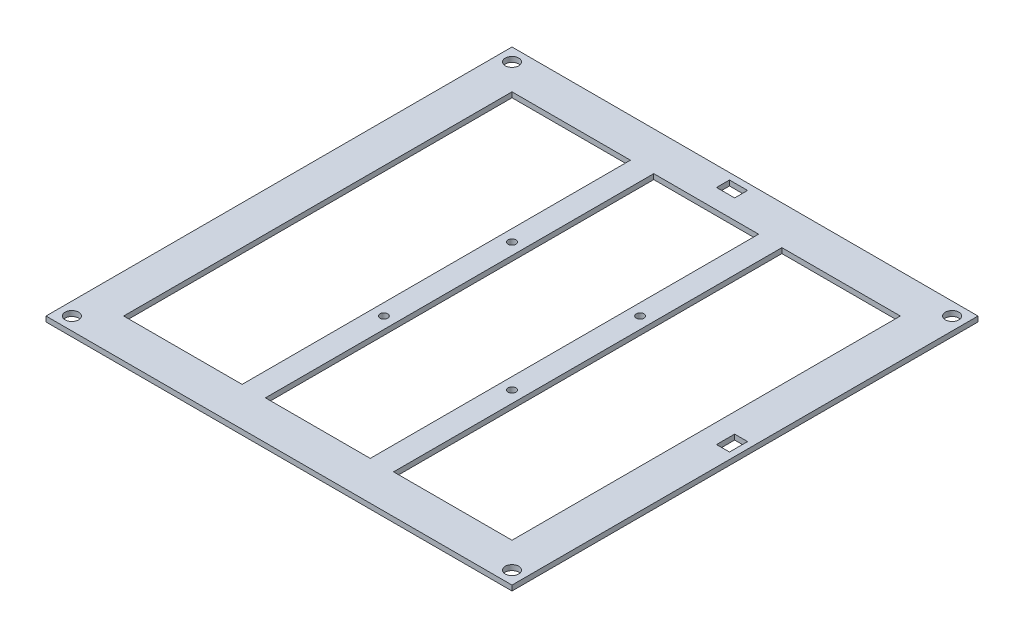
ISO-10303-21;
HEADER;
FILE_DESCRIPTION(('STEP AP214'),'2;1');
FILE_NAME('part.step','',(''),(''),'','','');
FILE_SCHEMA(('AUTOMOTIVE_DESIGN { 1 0 10303 214 1 1 1 1 }'));
ENDSEC;
DATA;
#1=APPLICATION_CONTEXT('core data for automotive mechanical design processes');
#2=APPLICATION_PROTOCOL_DEFINITION('international standard','automotive_design',2000,#1);
#3=PRODUCT_CONTEXT('',#1,'mechanical');
#4=PRODUCT('Part','Part','',(#3));
#5=PRODUCT_RELATED_PRODUCT_CATEGORY('part','',(#4));
#6=PRODUCT_DEFINITION_FORMATION('','',#4);
#7=PRODUCT_DEFINITION_CONTEXT('part definition',#1,'design');
#8=PRODUCT_DEFINITION('design','',#6,#7);
#9=PRODUCT_DEFINITION_SHAPE('','',#8);
#10=(LENGTH_UNIT() NAMED_UNIT(*) SI_UNIT(.MILLI.,.METRE.));
#11=(NAMED_UNIT(*) PLANE_ANGLE_UNIT() SI_UNIT($,.RADIAN.));
#12=(NAMED_UNIT(*) SI_UNIT($,.STERADIAN.) SOLID_ANGLE_UNIT());
#13=UNCERTAINTY_MEASURE_WITH_UNIT(LENGTH_MEASURE(1.E-05),#10,'distance_accuracy_value','');
#14=(GEOMETRIC_REPRESENTATION_CONTEXT(3) GLOBAL_UNCERTAINTY_ASSIGNED_CONTEXT((#13)) GLOBAL_UNIT_ASSIGNED_CONTEXT((#10,
#11,#12)) REPRESENTATION_CONTEXT('',''));
#15=CARTESIAN_POINT('',(0.,0.,0.));
#16=DIRECTION('',(0.,0.,1.));
#17=DIRECTION('',(1.,0.,0.));
#18=AXIS2_PLACEMENT_3D('',#15,#16,#17);
#19=CARTESIAN_POINT('',(0.,2.,0.));
#20=DIRECTION('',(0.,1.,0.));
#21=DIRECTION('',(0.,0.,1.));
#22=AXIS2_PLACEMENT_3D('',#19,#20,#21);
#23=PLANE('',#22);
#24=DIRECTION('',(-1.,0.,0.));
#25=VECTOR('',#24,1.);
#26=CARTESIAN_POINT('',(81.5,2.,-172.5));
#27=LINE('',#26,#25);
#28=CARTESIAN_POINT('',(88.5,2.,-172.5));
#29=VERTEX_POINT('',#28);
#30=CARTESIAN_POINT('',(81.5,2.,-172.5));
#31=VERTEX_POINT('',#30);
#32=EDGE_CURVE('E223',#29,#31,#27,.T.);
#33=ORIENTED_EDGE('',*,*,#32,.F.);
#34=DIRECTION('',(0.,0.,-1.));
#35=VECTOR('',#34,1.);
#36=CARTESIAN_POINT('',(88.5,2.,-172.5));
#37=LINE('',#36,#35);
#38=CARTESIAN_POINT('',(88.5,2.,-167.5));
#39=VERTEX_POINT('',#38);
#40=EDGE_CURVE('E221',#39,#29,#37,.T.);
#41=ORIENTED_EDGE('',*,*,#40,.F.);
#42=DIRECTION('',(1.,0.,0.));
#43=VECTOR('',#42,1.);
#44=CARTESIAN_POINT('',(81.5,2.,-167.5));
#45=LINE('',#44,#43);
#46=CARTESIAN_POINT('',(81.5,2.,-167.5));
#47=VERTEX_POINT('',#46);
#48=EDGE_CURVE('E229',#47,#39,#45,.T.);
#49=ORIENTED_EDGE('',*,*,#48,.F.);
#50=DIRECTION('',(0.,0.,1.));
#51=VECTOR('',#50,1.);
#52=CARTESIAN_POINT('',(81.5,2.,-172.5));
#53=LINE('',#52,#51);
#54=EDGE_CURVE('E226',#31,#47,#53,.T.);
#55=ORIENTED_EDGE('',*,*,#54,.F.);
#56=EDGE_LOOP('',(#33,#41,#49,#55));
#57=FACE_BOUND('',#56,.T.);
#58=DIRECTION('',(-1.,0.,0.));
#59=VECTOR('',#58,1.);
#60=CARTESIAN_POINT('',(167.5,2.,-88.5));
#61=LINE('',#60,#59);
#62=CARTESIAN_POINT('',(172.5,2.,-88.5));
#63=VERTEX_POINT('',#62);
#64=CARTESIAN_POINT('',(167.5,2.,-88.5));
#65=VERTEX_POINT('',#64);
#66=EDGE_CURVE('E254',#63,#65,#61,.T.);
#67=ORIENTED_EDGE('',*,*,#66,.F.);
#68=DIRECTION('',(0.,0.,-1.));
#69=VECTOR('',#68,1.);
#70=CARTESIAN_POINT('',(172.5,2.,-81.5));
#71=LINE('',#70,#69);
#72=CARTESIAN_POINT('',(172.5,2.,-81.5));
#73=VERTEX_POINT('',#72);
#74=EDGE_CURVE('E252',#73,#63,#71,.T.);
#75=ORIENTED_EDGE('',*,*,#74,.F.);
#76=DIRECTION('',(1.,0.,0.));
#77=VECTOR('',#76,1.);
#78=CARTESIAN_POINT('',(167.5,2.,-81.5));
#79=LINE('',#78,#77);
#80=CARTESIAN_POINT('',(167.5,2.,-81.5));
#81=VERTEX_POINT('',#80);
#82=EDGE_CURVE('E260',#81,#73,#79,.T.);
#83=ORIENTED_EDGE('',*,*,#82,.F.);
#84=DIRECTION('',(0.,0.,1.));
#85=VECTOR('',#84,1.);
#86=CARTESIAN_POINT('',(167.5,2.,-81.5));
#87=LINE('',#86,#85);
#88=EDGE_CURVE('E257',#65,#81,#87,.T.);
#89=ORIENTED_EDGE('',*,*,#88,.F.);
#90=EDGE_LOOP('',(#67,#75,#83,#89));
#91=FACE_BOUND('',#90,.T.);
#92=CARTESIAN_POINT('',(170.,2.,-170.));
#93=DIRECTION('',(0.,1.,0.));
#94=DIRECTION('',(0.,0.,-1.));
#95=AXIS2_PLACEMENT_3D('',#92,#93,#94);
#96=CIRCLE('',#95,2.59999999999999);
#97=CARTESIAN_POINT('',(170.,2.,-172.6));
#98=VERTEX_POINT('',#97);
#99=EDGE_CURVE('E283',#98,#98,#96,.T.);
#100=ORIENTED_EDGE('',*,*,#99,.F.);
#101=EDGE_LOOP('',(#100));
#102=FACE_BOUND('',#101,.T.);
#103=CARTESIAN_POINT('',(109.75,2.,-60.25));
#104=DIRECTION('',(0.,1.,0.));
#105=DIRECTION('',(0.,0.,-1.));
#106=AXIS2_PLACEMENT_3D('',#103,#104,#105);
#107=CIRCLE('',#106,1.5);
#108=CARTESIAN_POINT('',(109.75,2.,-61.75));
#109=VERTEX_POINT('',#108);
#110=EDGE_CURVE('E295',#109,#109,#107,.T.);
#111=ORIENTED_EDGE('',*,*,#110,.F.);
#112=EDGE_LOOP('',(#111));
#113=FACE_BOUND('',#112,.T.);
#114=CARTESIAN_POINT('',(0.,2.,0.));
#115=DIRECTION('',(0.,1.,0.));
#116=DIRECTION('',(0.,0.,1.));
#117=AXIS2_PLACEMENT_3D('',#114,#115,#116);
#118=CIRCLE('',#117,2.6);
#119=CARTESIAN_POINT('',(0.,2.,2.6));
#120=VERTEX_POINT('',#119);
#121=EDGE_CURVE('E307',#120,#120,#118,.T.);
#122=ORIENTED_EDGE('',*,*,#121,.F.);
#123=EDGE_LOOP('',(#122));
#124=FACE_BOUND('',#123,.T.);
#125=DIRECTION('',(0.,0.,-1.));
#126=VECTOR('',#125,1.);
#127=CARTESIAN_POINT('',(105.25,2.,-160.));
#128=LINE('',#127,#126);
#129=CARTESIAN_POINT('',(105.25,2.,-10.));
#130=VERTEX_POINT('',#129);
#131=CARTESIAN_POINT('',(105.25,2.,-160.));
#132=VERTEX_POINT('',#131);
#133=EDGE_CURVE('E321',#130,#132,#128,.T.);
#134=ORIENTED_EDGE('',*,*,#133,.F.);
#135=DIRECTION('',(1.,0.,0.));
#136=VECTOR('',#135,1.);
#137=CARTESIAN_POINT('',(64.75,2.,-10.));
#138=LINE('',#137,#136);
#139=CARTESIAN_POINT('',(64.75,2.,-10.));
#140=VERTEX_POINT('',#139);
#141=EDGE_CURVE('E319',#140,#130,#138,.T.);
#142=ORIENTED_EDGE('',*,*,#141,.F.);
#143=DIRECTION('',(0.,0.,1.));
#144=VECTOR('',#143,1.);
#145=CARTESIAN_POINT('',(64.75,2.,-160.));
#146=LINE('',#145,#144);
#147=CARTESIAN_POINT('',(64.75,2.,-160.));
#148=VERTEX_POINT('',#147);
#149=EDGE_CURVE('E327',#148,#140,#146,.T.);
#150=ORIENTED_EDGE('',*,*,#149,.F.);
#151=DIRECTION('',(-1.,0.,0.));
#152=VECTOR('',#151,1.);
#153=CARTESIAN_POINT('',(64.75,2.,-160.));
#154=LINE('',#153,#152);
#155=EDGE_CURVE('E324',#132,#148,#154,.T.);
#156=ORIENTED_EDGE('',*,*,#155,.F.);
#157=EDGE_LOOP('',(#134,#142,#150,#156));
#158=FACE_BOUND('',#157,.T.);
#159=CARTESIAN_POINT('',(60.25,2.,-60.25));
#160=DIRECTION('',(0.,1.,0.));
#161=DIRECTION('',(0.,0.,1.));
#162=AXIS2_PLACEMENT_3D('',#159,#160,#161);
#163=CIRCLE('',#162,1.50000000000001);
#164=CARTESIAN_POINT('',(60.25,2.,-58.75));
#165=VERTEX_POINT('',#164);
#166=EDGE_CURVE('E350',#165,#165,#163,.T.);
#167=ORIENTED_EDGE('',*,*,#166,.F.);
#168=EDGE_LOOP('',(#167));
#169=FACE_BOUND('',#168,.T.);
#170=DIRECTION('',(0.,0.,1.));
#171=VECTOR('',#170,1.);
#172=CARTESIAN_POINT('',(114.25,2.,-160.));
#173=LINE('',#172,#171);
#174=CARTESIAN_POINT('',(114.25,2.,-160.));
#175=VERTEX_POINT('',#174);
#176=CARTESIAN_POINT('',(114.25,2.,-10.));
#177=VERTEX_POINT('',#176);
#178=EDGE_CURVE('E364',#175,#177,#173,.T.);
#179=ORIENTED_EDGE('',*,*,#178,.F.);
#180=DIRECTION('',(-1.,0.,0.));
#181=VECTOR('',#180,1.);
#182=CARTESIAN_POINT('',(114.25,2.,-160.));
#183=LINE('',#182,#181);
#184=CARTESIAN_POINT('',(160.,2.,-160.));
#185=VERTEX_POINT('',#184);
#186=EDGE_CURVE('E362',#185,#175,#183,.T.);
#187=ORIENTED_EDGE('',*,*,#186,.F.);
#188=DIRECTION('',(0.,0.,-1.));
#189=VECTOR('',#188,1.);
#190=CARTESIAN_POINT('',(160.,2.,-10.));
#191=LINE('',#190,#189);
#192=CARTESIAN_POINT('',(160.,2.,-10.));
#193=VERTEX_POINT('',#192);
#194=EDGE_CURVE('E370',#193,#185,#191,.T.);
#195=ORIENTED_EDGE('',*,*,#194,.F.);
#196=DIRECTION('',(1.,0.,0.));
#197=VECTOR('',#196,1.);
#198=CARTESIAN_POINT('',(114.25,2.,-10.));
#199=LINE('',#198,#197);
#200=EDGE_CURVE('E367',#177,#193,#199,.T.);
#201=ORIENTED_EDGE('',*,*,#200,.F.);
#202=EDGE_LOOP('',(#179,#187,#195,#201));
#203=FACE_BOUND('',#202,.T.);
#204=DIRECTION('',(0.,0.,-1.));
#205=VECTOR('',#204,1.);
#206=CARTESIAN_POINT('',(55.75,2.,-160.));
#207=LINE('',#206,#205);
#208=CARTESIAN_POINT('',(55.75,2.,-10.));
#209=VERTEX_POINT('',#208);
#210=CARTESIAN_POINT('',(55.75,2.,-160.));
#211=VERTEX_POINT('',#210);
#212=EDGE_CURVE('E395',#209,#211,#207,.T.);
#213=ORIENTED_EDGE('',*,*,#212,.F.);
#214=DIRECTION('',(1.,0.,0.));
#215=VECTOR('',#214,1.);
#216=CARTESIAN_POINT('',(10.,2.,-10.));
#217=LINE('',#216,#215);
#218=CARTESIAN_POINT('',(10.,2.,-10.));
#219=VERTEX_POINT('',#218);
#220=EDGE_CURVE('E393',#219,#209,#217,.T.);
#221=ORIENTED_EDGE('',*,*,#220,.F.);
#222=DIRECTION('',(0.,0.,1.));
#223=VECTOR('',#222,1.);
#224=CARTESIAN_POINT('',(10.,2.,-10.));
#225=LINE('',#224,#223);
#226=CARTESIAN_POINT('',(10.,2.,-160.));
#227=VERTEX_POINT('',#226);
#228=EDGE_CURVE('E401',#227,#219,#225,.T.);
#229=ORIENTED_EDGE('',*,*,#228,.F.);
#230=DIRECTION('',(-1.,0.,0.));
#231=VECTOR('',#230,1.);
#232=CARTESIAN_POINT('',(10.,2.,-160.));
#233=LINE('',#232,#231);
#234=EDGE_CURVE('E398',#211,#227,#233,.T.);
#235=ORIENTED_EDGE('',*,*,#234,.F.);
#236=EDGE_LOOP('',(#213,#221,#229,#235));
#237=FACE_BOUND('',#236,.T.);
#238=CARTESIAN_POINT('',(60.25,2.,-109.75));
#239=DIRECTION('',(0.,1.,0.));
#240=DIRECTION('',(0.,0.,1.));
#241=AXIS2_PLACEMENT_3D('',#238,#239,#240);
#242=CIRCLE('',#241,1.5);
#243=CARTESIAN_POINT('',(60.25,2.,-108.25));
#244=VERTEX_POINT('',#243);
#245=EDGE_CURVE('E356',#244,#244,#242,.T.);
#246=ORIENTED_EDGE('',*,*,#245,.F.);
#247=EDGE_LOOP('',(#246));
#248=FACE_BOUND('',#247,.T.);
#249=CARTESIAN_POINT('',(0.,2.,-170.));
#250=DIRECTION('',(0.,1.,0.));
#251=DIRECTION('',(0.,0.,1.));
#252=AXIS2_PLACEMENT_3D('',#249,#250,#251);
#253=CIRCLE('',#252,2.6);
#254=CARTESIAN_POINT('',(0.,2.,-167.4));
#255=VERTEX_POINT('',#254);
#256=EDGE_CURVE('E313',#255,#255,#253,.T.);
#257=ORIENTED_EDGE('',*,*,#256,.F.);
#258=EDGE_LOOP('',(#257));
#259=FACE_BOUND('',#258,.T.);
#260=CARTESIAN_POINT('',(109.75,2.,-109.75));
#261=DIRECTION('',(0.,1.,0.));
#262=DIRECTION('',(0.,0.,-1.));
#263=AXIS2_PLACEMENT_3D('',#260,#261,#262);
#264=CIRCLE('',#263,1.5);
#265=CARTESIAN_POINT('',(109.75,2.,-111.25));
#266=VERTEX_POINT('',#265);
#267=EDGE_CURVE('E301',#266,#266,#264,.T.);
#268=ORIENTED_EDGE('',*,*,#267,.F.);
#269=EDGE_LOOP('',(#268));
#270=FACE_BOUND('',#269,.T.);
#271=CARTESIAN_POINT('',(170.,2.,0.));
#272=DIRECTION('',(0.,1.,0.));
#273=DIRECTION('',(0.,0.,-1.));
#274=AXIS2_PLACEMENT_3D('',#271,#272,#273);
#275=CIRCLE('',#274,2.59999999999999);
#276=CARTESIAN_POINT('',(170.,2.,-2.59999999999999));
#277=VERTEX_POINT('',#276);
#278=EDGE_CURVE('E289',#277,#277,#275,.T.);
#279=ORIENTED_EDGE('',*,*,#278,.F.);
#280=EDGE_LOOP('',(#279));
#281=FACE_BOUND('',#280,.T.);
#282=DIRECTION('',(-1.,0.,0.));
#283=VECTOR('',#282,1.);
#284=CARTESIAN_POINT('',(175.,2.,-175.));
#285=LINE('',#284,#283);
#286=CARTESIAN_POINT('',(175.,2.,-175.));
#287=VERTEX_POINT('',#286);
#288=CARTESIAN_POINT('',(-5.,2.,-175.));
#289=VERTEX_POINT('',#288);
#290=EDGE_CURVE('E203',#287,#289,#285,.T.);
#291=ORIENTED_EDGE('',*,*,#290,.T.);
#292=DIRECTION('',(0.,0.,1.));
#293=VECTOR('',#292,1.);
#294=CARTESIAN_POINT('',(-5.,2.,-175.));
#295=LINE('',#294,#293);
#296=CARTESIAN_POINT('',(-5.,2.,5.));
#297=VERTEX_POINT('',#296);
#298=EDGE_CURVE('E213',#289,#297,#295,.T.);
#299=ORIENTED_EDGE('',*,*,#298,.T.);
#300=DIRECTION('',(1.,0.,0.));
#301=VECTOR('',#300,1.);
#302=CARTESIAN_POINT('',(-5.,2.,5.));
#303=LINE('',#302,#301);
#304=CARTESIAN_POINT('',(175.,2.,5.));
#305=VERTEX_POINT('',#304);
#306=EDGE_CURVE('E211',#297,#305,#303,.T.);
#307=ORIENTED_EDGE('',*,*,#306,.T.);
#308=DIRECTION('',(0.,0.,-1.));
#309=VECTOR('',#308,1.);
#310=CARTESIAN_POINT('',(175.,2.,5.));
#311=LINE('',#310,#309);
#312=EDGE_CURVE('E48',#305,#287,#311,.T.);
#313=ORIENTED_EDGE('',*,*,#312,.T.);
#314=EDGE_LOOP('',(#291,#299,#307,#313));
#315=FACE_BOUND('',#314,.T.);
#316=ADVANCED_FACE('F33',(#57,#91,#102,#113,#124,#158,#169,#203,#237,#248,#259,#270,#281,#315),
#23,.T.);
#317=CARTESIAN_POINT('',(0.,0.,0.));
#318=DIRECTION('',(0.,1.,0.));
#319=DIRECTION('',(0.,0.,1.));
#320=AXIS2_PLACEMENT_3D('',#317,#318,#319);
#321=PLANE('',#320);
#322=DIRECTION('',(0.,0.,-1.));
#323=VECTOR('',#322,1.);
#324=CARTESIAN_POINT('',(88.5,0.,-172.5));
#325=LINE('',#324,#323);
#326=CARTESIAN_POINT('',(88.5,0.,-167.5));
#327=VERTEX_POINT('',#326);
#328=CARTESIAN_POINT('',(88.5,0.,-172.5));
#329=VERTEX_POINT('',#328);
#330=EDGE_CURVE('E217',#327,#329,#325,.T.);
#331=ORIENTED_EDGE('',*,*,#330,.T.);
#332=DIRECTION('',(-1.,0.,0.));
#333=VECTOR('',#332,1.);
#334=CARTESIAN_POINT('',(81.5,0.,-172.5));
#335=LINE('',#334,#333);
#336=CARTESIAN_POINT('',(81.5,0.,-172.5));
#337=VERTEX_POINT('',#336);
#338=EDGE_CURVE('E234',#329,#337,#335,.T.);
#339=ORIENTED_EDGE('',*,*,#338,.T.);
#340=DIRECTION('',(0.,0.,1.));
#341=VECTOR('',#340,1.);
#342=CARTESIAN_POINT('',(81.5,0.,-172.5));
#343=LINE('',#342,#341);
#344=CARTESIAN_POINT('',(81.5,0.,-167.5));
#345=VERTEX_POINT('',#344);
#346=EDGE_CURVE('E237',#337,#345,#343,.T.);
#347=ORIENTED_EDGE('',*,*,#346,.T.);
#348=DIRECTION('',(1.,0.,0.));
#349=VECTOR('',#348,1.);
#350=CARTESIAN_POINT('',(81.5,0.,-167.5));
#351=LINE('',#350,#349);
#352=EDGE_CURVE('E224',#345,#327,#351,.T.);
#353=ORIENTED_EDGE('',*,*,#352,.T.);
#354=EDGE_LOOP('',(#331,#339,#347,#353));
#355=FACE_BOUND('',#354,.T.);
#356=CARTESIAN_POINT('',(170.,0.,-170.));
#357=DIRECTION('',(0.,1.,0.));
#358=DIRECTION('',(0.,0.,-1.));
#359=AXIS2_PLACEMENT_3D('',#356,#357,#358);
#360=CIRCLE('',#359,2.59999999999999);
#361=CARTESIAN_POINT('',(170.,0.,-172.6));
#362=VERTEX_POINT('',#361);
#363=EDGE_CURVE('E282',#362,#362,#360,.T.);
#364=ORIENTED_EDGE('',*,*,#363,.T.);
#365=EDGE_LOOP('',(#364));
#366=FACE_BOUND('',#365,.T.);
#367=CARTESIAN_POINT('',(170.,0.,0.));
#368=DIRECTION('',(0.,1.,0.));
#369=DIRECTION('',(0.,0.,-1.));
#370=AXIS2_PLACEMENT_3D('',#367,#368,#369);
#371=CIRCLE('',#370,2.59999999999999);
#372=CARTESIAN_POINT('',(170.,0.,-2.59999999999999));
#373=VERTEX_POINT('',#372);
#374=EDGE_CURVE('E286',#373,#373,#371,.T.);
#375=ORIENTED_EDGE('',*,*,#374,.T.);
#376=EDGE_LOOP('',(#375));
#377=FACE_BOUND('',#376,.T.);
#378=CARTESIAN_POINT('',(109.75,0.,-60.25));
#379=DIRECTION('',(0.,1.,0.));
#380=DIRECTION('',(0.,0.,-1.));
#381=AXIS2_PLACEMENT_3D('',#378,#379,#380);
#382=CIRCLE('',#381,1.5);
#383=CARTESIAN_POINT('',(109.75,0.,-61.75));
#384=VERTEX_POINT('',#383);
#385=EDGE_CURVE('E292',#384,#384,#382,.T.);
#386=ORIENTED_EDGE('',*,*,#385,.T.);
#387=EDGE_LOOP('',(#386));
#388=FACE_BOUND('',#387,.T.);
#389=CARTESIAN_POINT('',(109.75,0.,-109.75));
#390=DIRECTION('',(0.,1.,0.));
#391=DIRECTION('',(0.,0.,-1.));
#392=AXIS2_PLACEMENT_3D('',#389,#390,#391);
#393=CIRCLE('',#392,1.5);
#394=CARTESIAN_POINT('',(109.75,0.,-111.25));
#395=VERTEX_POINT('',#394);
#396=EDGE_CURVE('E298',#395,#395,#393,.T.);
#397=ORIENTED_EDGE('',*,*,#396,.T.);
#398=EDGE_LOOP('',(#397));
#399=FACE_BOUND('',#398,.T.);
#400=CARTESIAN_POINT('',(0.,0.,0.));
#401=DIRECTION('',(0.,1.,0.));
#402=DIRECTION('',(0.,0.,1.));
#403=AXIS2_PLACEMENT_3D('',#400,#401,#402);
#404=CIRCLE('',#403,2.6);
#405=CARTESIAN_POINT('',(0.,0.,2.6));
#406=VERTEX_POINT('',#405);
#407=EDGE_CURVE('E304',#406,#406,#404,.T.);
#408=ORIENTED_EDGE('',*,*,#407,.T.);
#409=EDGE_LOOP('',(#408));
#410=FACE_BOUND('',#409,.T.);
#411=CARTESIAN_POINT('',(0.,0.,-170.));
#412=DIRECTION('',(0.,1.,0.));
#413=DIRECTION('',(0.,0.,1.));
#414=AXIS2_PLACEMENT_3D('',#411,#412,#413);
#415=CIRCLE('',#414,2.6);
#416=CARTESIAN_POINT('',(0.,0.,-167.4));
#417=VERTEX_POINT('',#416);
#418=EDGE_CURVE('E310',#417,#417,#415,.T.);
#419=ORIENTED_EDGE('',*,*,#418,.T.);
#420=EDGE_LOOP('',(#419));
#421=FACE_BOUND('',#420,.T.);
#422=DIRECTION('',(1.,0.,0.));
#423=VECTOR('',#422,1.);
#424=CARTESIAN_POINT('',(64.75,0.,-10.));
#425=LINE('',#424,#423);
#426=CARTESIAN_POINT('',(64.75,0.,-10.));
#427=VERTEX_POINT('',#426);
#428=CARTESIAN_POINT('',(105.25,0.,-10.));
#429=VERTEX_POINT('',#428);
#430=EDGE_CURVE('E316',#427,#429,#425,.T.);
#431=ORIENTED_EDGE('',*,*,#430,.T.);
#432=DIRECTION('',(0.,0.,-1.));
#433=VECTOR('',#432,1.);
#434=CARTESIAN_POINT('',(105.25,0.,-160.));
#435=LINE('',#434,#433);
#436=CARTESIAN_POINT('',(105.25,0.,-160.));
#437=VERTEX_POINT('',#436);
#438=EDGE_CURVE('E332',#429,#437,#435,.T.);
#439=ORIENTED_EDGE('',*,*,#438,.T.);
#440=DIRECTION('',(-1.,0.,0.));
#441=VECTOR('',#440,1.);
#442=CARTESIAN_POINT('',(64.75,0.,-160.));
#443=LINE('',#442,#441);
#444=CARTESIAN_POINT('',(64.75,0.,-160.));
#445=VERTEX_POINT('',#444);
#446=EDGE_CURVE('E335',#437,#445,#443,.T.);
#447=ORIENTED_EDGE('',*,*,#446,.T.);
#448=DIRECTION('',(0.,0.,1.));
#449=VECTOR('',#448,1.);
#450=CARTESIAN_POINT('',(64.75,0.,-160.));
#451=LINE('',#450,#449);
#452=EDGE_CURVE('E322',#445,#427,#451,.T.);
#453=ORIENTED_EDGE('',*,*,#452,.T.);
#454=EDGE_LOOP('',(#431,#439,#447,#453));
#455=FACE_BOUND('',#454,.T.);
#456=DIRECTION('',(1.,0.,0.));
#457=VECTOR('',#456,1.);
#458=CARTESIAN_POINT('',(10.,0.,-10.));
#459=LINE('',#458,#457);
#460=CARTESIAN_POINT('',(10.,0.,-10.));
#461=VERTEX_POINT('',#460);
#462=CARTESIAN_POINT('',(55.75,0.,-10.));
#463=VERTEX_POINT('',#462);
#464=EDGE_CURVE('E392',#461,#463,#459,.T.);
#465=ORIENTED_EDGE('',*,*,#464,.T.);
#466=DIRECTION('',(0.,0.,-1.));
#467=VECTOR('',#466,1.);
#468=CARTESIAN_POINT('',(55.75,0.,-160.));
#469=LINE('',#468,#467);
#470=CARTESIAN_POINT('',(55.75,0.,-160.));
#471=VERTEX_POINT('',#470);
#472=EDGE_CURVE('E406',#463,#471,#469,.T.);
#473=ORIENTED_EDGE('',*,*,#472,.T.);
#474=DIRECTION('',(-1.,0.,0.));
#475=VECTOR('',#474,1.);
#476=CARTESIAN_POINT('',(10.,0.,-160.));
#477=LINE('',#476,#475);
#478=CARTESIAN_POINT('',(10.,0.,-160.));
#479=VERTEX_POINT('',#478);
#480=EDGE_CURVE('E409',#471,#479,#477,.T.);
#481=ORIENTED_EDGE('',*,*,#480,.T.);
#482=DIRECTION('',(0.,0.,1.));
#483=VECTOR('',#482,1.);
#484=CARTESIAN_POINT('',(10.,0.,-10.));
#485=LINE('',#484,#483);
#486=EDGE_CURVE('E396',#479,#461,#485,.T.);
#487=ORIENTED_EDGE('',*,*,#486,.T.);
#488=EDGE_LOOP('',(#465,#473,#481,#487));
#489=FACE_BOUND('',#488,.T.);
#490=DIRECTION('',(-1.,0.,0.));
#491=VECTOR('',#490,1.);
#492=CARTESIAN_POINT('',(114.25,0.,-160.));
#493=LINE('',#492,#491);
#494=CARTESIAN_POINT('',(160.,0.,-160.));
#495=VERTEX_POINT('',#494);
#496=CARTESIAN_POINT('',(114.25,0.,-160.));
#497=VERTEX_POINT('',#496);
#498=EDGE_CURVE('E359',#495,#497,#493,.T.);
#499=ORIENTED_EDGE('',*,*,#498,.T.);
#500=DIRECTION('',(0.,0.,1.));
#501=VECTOR('',#500,1.);
#502=CARTESIAN_POINT('',(114.25,0.,-160.));
#503=LINE('',#502,#501);
#504=CARTESIAN_POINT('',(114.25,0.,-10.));
#505=VERTEX_POINT('',#504);
#506=EDGE_CURVE('E375',#497,#505,#503,.T.);
#507=ORIENTED_EDGE('',*,*,#506,.T.);
#508=DIRECTION('',(1.,0.,0.));
#509=VECTOR('',#508,1.);
#510=CARTESIAN_POINT('',(114.25,0.,-10.));
#511=LINE('',#510,#509);
#512=CARTESIAN_POINT('',(160.,0.,-10.));
#513=VERTEX_POINT('',#512);
#514=EDGE_CURVE('E378',#505,#513,#511,.T.);
#515=ORIENTED_EDGE('',*,*,#514,.T.);
#516=DIRECTION('',(0.,0.,-1.));
#517=VECTOR('',#516,1.);
#518=CARTESIAN_POINT('',(160.,0.,-10.));
#519=LINE('',#518,#517);
#520=EDGE_CURVE('E365',#513,#495,#519,.T.);
#521=ORIENTED_EDGE('',*,*,#520,.T.);
#522=EDGE_LOOP('',(#499,#507,#515,#521));
#523=FACE_BOUND('',#522,.T.);
#524=CARTESIAN_POINT('',(60.25,0.,-109.75));
#525=DIRECTION('',(0.,1.,0.));
#526=DIRECTION('',(0.,0.,1.));
#527=AXIS2_PLACEMENT_3D('',#524,#525,#526);
#528=CIRCLE('',#527,1.5);
#529=CARTESIAN_POINT('',(60.25,0.,-108.25));
#530=VERTEX_POINT('',#529);
#531=EDGE_CURVE('E353',#530,#530,#528,.T.);
#532=ORIENTED_EDGE('',*,*,#531,.T.);
#533=EDGE_LOOP('',(#532));
#534=FACE_BOUND('',#533,.T.);
#535=CARTESIAN_POINT('',(60.25,0.,-60.25));
#536=DIRECTION('',(0.,1.,0.));
#537=DIRECTION('',(0.,0.,1.));
#538=AXIS2_PLACEMENT_3D('',#535,#536,#537);
#539=CIRCLE('',#538,1.50000000000001);
#540=CARTESIAN_POINT('',(60.25,0.,-58.75));
#541=VERTEX_POINT('',#540);
#542=EDGE_CURVE('E349',#541,#541,#539,.T.);
#543=ORIENTED_EDGE('',*,*,#542,.T.);
#544=EDGE_LOOP('',(#543));
#545=FACE_BOUND('',#544,.T.);
#546=DIRECTION('',(0.,0.,-1.));
#547=VECTOR('',#546,1.);
#548=CARTESIAN_POINT('',(172.5,0.,-81.5));
#549=LINE('',#548,#547);
#550=CARTESIAN_POINT('',(172.5,0.,-81.5));
#551=VERTEX_POINT('',#550);
#552=CARTESIAN_POINT('',(172.5,0.,-88.5));
#553=VERTEX_POINT('',#552);
#554=EDGE_CURVE('E251',#551,#553,#549,.T.);
#555=ORIENTED_EDGE('',*,*,#554,.T.);
#556=DIRECTION('',(-1.,0.,0.));
#557=VECTOR('',#556,1.);
#558=CARTESIAN_POINT('',(167.5,0.,-88.5));
#559=LINE('',#558,#557);
#560=CARTESIAN_POINT('',(167.5,0.,-88.5));
#561=VERTEX_POINT('',#560);
#562=EDGE_CURVE('E265',#553,#561,#559,.T.);
#563=ORIENTED_EDGE('',*,*,#562,.T.);
#564=DIRECTION('',(0.,0.,1.));
#565=VECTOR('',#564,1.);
#566=CARTESIAN_POINT('',(167.5,0.,-81.5));
#567=LINE('',#566,#565);
#568=CARTESIAN_POINT('',(167.5,0.,-81.5));
#569=VERTEX_POINT('',#568);
#570=EDGE_CURVE('E268',#561,#569,#567,.T.);
#571=ORIENTED_EDGE('',*,*,#570,.T.);
#572=DIRECTION('',(1.,0.,0.));
#573=VECTOR('',#572,1.);
#574=CARTESIAN_POINT('',(167.5,0.,-81.5));
#575=LINE('',#574,#573);
#576=EDGE_CURVE('E255',#569,#551,#575,.T.);
#577=ORIENTED_EDGE('',*,*,#576,.T.);
#578=EDGE_LOOP('',(#555,#563,#571,#577));
#579=FACE_BOUND('',#578,.T.);
#580=DIRECTION('',(0.,0.,1.));
#581=VECTOR('',#580,1.);
#582=CARTESIAN_POINT('',(-5.,0.,0.));
#583=LINE('',#582,#581);
#584=CARTESIAN_POINT('',(-5.,0.,-175.));
#585=VERTEX_POINT('',#584);
#586=CARTESIAN_POINT('',(-5.,0.,5.));
#587=VERTEX_POINT('',#586);
#588=EDGE_CURVE('E11',#585,#587,#583,.T.);
#589=ORIENTED_EDGE('',*,*,#588,.F.);
#590=DIRECTION('',(-1.,0.,0.));
#591=VECTOR('',#590,1.);
#592=CARTESIAN_POINT('',(0.,0.,-175.));
#593=LINE('',#592,#591);
#594=CARTESIAN_POINT('',(175.,0.,-175.));
#595=VERTEX_POINT('',#594);
#596=EDGE_CURVE('E41',#595,#585,#593,.T.);
#597=ORIENTED_EDGE('',*,*,#596,.F.);
#598=DIRECTION('',(0.,0.,-1.));
#599=VECTOR('',#598,1.);
#600=CARTESIAN_POINT('',(175.,0.,0.));
#601=LINE('',#600,#599);
#602=CARTESIAN_POINT('',(175.,0.,5.));
#603=VERTEX_POINT('',#602);
#604=EDGE_CURVE('E196',#603,#595,#601,.T.);
#605=ORIENTED_EDGE('',*,*,#604,.F.);
#606=DIRECTION('',(1.,0.,0.));
#607=VECTOR('',#606,1.);
#608=CARTESIAN_POINT('',(0.,0.,5.));
#609=LINE('',#608,#607);
#610=EDGE_CURVE('E423',#587,#603,#609,.T.);
#611=ORIENTED_EDGE('',*,*,#610,.F.);
#612=EDGE_LOOP('',(#589,#597,#605,#611));
#613=FACE_BOUND('',#612,.T.);
#614=ADVANCED_FACE('F35',(#355,#366,#377,#388,#399,#410,#421,#455,#489,#523,#534,#545,#579,
#613),#321,.F.);
#615=CARTESIAN_POINT('',(10.,2.,-10.));
#616=DIRECTION('',(0.,0.,-1.));
#617=DIRECTION('',(-1.,0.,0.));
#618=AXIS2_PLACEMENT_3D('',#615,#616,#617);
#619=PLANE('',#618);
#620=ORIENTED_EDGE('',*,*,#464,.F.);
#621=DIRECTION('',(0.,-1.,0.));
#622=VECTOR('',#621,1.);
#623=CARTESIAN_POINT('',(10.,2.,-10.));
#624=LINE('',#623,#622);
#625=EDGE_CURVE('E403',#219,#461,#624,.T.);
#626=ORIENTED_EDGE('',*,*,#625,.F.);
#627=ORIENTED_EDGE('',*,*,#220,.T.);
#628=DIRECTION('',(0.,-1.,0.));
#629=VECTOR('',#628,1.);
#630=CARTESIAN_POINT('',(55.75,2.,-10.));
#631=LINE('',#630,#629);
#632=EDGE_CURVE('E420',#209,#463,#631,.T.);
#633=ORIENTED_EDGE('',*,*,#632,.T.);
#634=EDGE_LOOP('',(#620,#626,#627,#633));
#635=FACE_BOUND('',#634,.T.);
#636=ADVANCED_FACE('F443',(#635),#619,.T.);
#637=CARTESIAN_POINT('',(55.75,2.,-160.));
#638=DIRECTION('',(-1.,0.,0.));
#639=DIRECTION('',(0.,0.,1.));
#640=AXIS2_PLACEMENT_3D('',#637,#638,#639);
#641=PLANE('',#640);
#642=ORIENTED_EDGE('',*,*,#472,.F.);
#643=ORIENTED_EDGE('',*,*,#632,.F.);
#644=ORIENTED_EDGE('',*,*,#212,.T.);
#645=DIRECTION('',(0.,-1.,0.));
#646=VECTOR('',#645,1.);
#647=CARTESIAN_POINT('',(55.75,2.,-160.));
#648=LINE('',#647,#646);
#649=EDGE_CURVE('E418',#211,#471,#648,.T.);
#650=ORIENTED_EDGE('',*,*,#649,.T.);
#651=EDGE_LOOP('',(#642,#643,#644,#650));
#652=FACE_BOUND('',#651,.T.);
#653=ADVANCED_FACE('F450',(#652),#641,.T.);
#654=CARTESIAN_POINT('',(10.,2.,-160.));
#655=DIRECTION('',(0.,0.,1.));
#656=DIRECTION('',(1.,0.,0.));
#657=AXIS2_PLACEMENT_3D('',#654,#655,#656);
#658=PLANE('',#657);
#659=ORIENTED_EDGE('',*,*,#480,.F.);
#660=ORIENTED_EDGE('',*,*,#649,.F.);
#661=ORIENTED_EDGE('',*,*,#234,.T.);
#662=DIRECTION('',(0.,-1.,0.));
#663=VECTOR('',#662,1.);
#664=CARTESIAN_POINT('',(10.,2.,-160.));
#665=LINE('',#664,#663);
#666=EDGE_CURVE('E416',#227,#479,#665,.T.);
#667=ORIENTED_EDGE('',*,*,#666,.T.);
#668=EDGE_LOOP('',(#659,#660,#661,#667));
#669=FACE_BOUND('',#668,.T.);
#670=ADVANCED_FACE('F454',(#669),#658,.T.);
#671=CARTESIAN_POINT('',(10.,2.,-10.));
#672=DIRECTION('',(1.,0.,0.));
#673=DIRECTION('',(0.,0.,-1.));
#674=AXIS2_PLACEMENT_3D('',#671,#672,#673);
#675=PLANE('',#674);
#676=ORIENTED_EDGE('',*,*,#486,.F.);
#677=ORIENTED_EDGE('',*,*,#666,.F.);
#678=ORIENTED_EDGE('',*,*,#228,.T.);
#679=ORIENTED_EDGE('',*,*,#625,.T.);
#680=EDGE_LOOP('',(#676,#677,#678,#679));
#681=FACE_BOUND('',#680,.T.);
#682=ADVANCED_FACE('F458',(#681),#675,.T.);
#683=CARTESIAN_POINT('',(114.25,2.,-160.));
#684=DIRECTION('',(0.,0.,1.));
#685=DIRECTION('',(1.,0.,0.));
#686=AXIS2_PLACEMENT_3D('',#683,#684,#685);
#687=PLANE('',#686);
#688=ORIENTED_EDGE('',*,*,#498,.F.);
#689=DIRECTION('',(0.,-1.,0.));
#690=VECTOR('',#689,1.);
#691=CARTESIAN_POINT('',(160.,2.,-160.));
#692=LINE('',#691,#690);
#693=EDGE_CURVE('E372',#185,#495,#692,.T.);
#694=ORIENTED_EDGE('',*,*,#693,.F.);
#695=ORIENTED_EDGE('',*,*,#186,.T.);
#696=DIRECTION('',(0.,-1.,0.));
#697=VECTOR('',#696,1.);
#698=CARTESIAN_POINT('',(114.25,2.,-160.));
#699=LINE('',#698,#697);
#700=EDGE_CURVE('E389',#175,#497,#699,.T.);
#701=ORIENTED_EDGE('',*,*,#700,.T.);
#702=EDGE_LOOP('',(#688,#694,#695,#701));
#703=FACE_BOUND('',#702,.T.);
#704=ADVANCED_FACE('F462',(#703),#687,.T.);
#705=CARTESIAN_POINT('',(114.25,2.,-160.));
#706=DIRECTION('',(1.,0.,0.));
#707=DIRECTION('',(0.,0.,-1.));
#708=AXIS2_PLACEMENT_3D('',#705,#706,#707);
#709=PLANE('',#708);
#710=ORIENTED_EDGE('',*,*,#506,.F.);
#711=ORIENTED_EDGE('',*,*,#700,.F.);
#712=ORIENTED_EDGE('',*,*,#178,.T.);
#713=DIRECTION('',(0.,-1.,0.));
#714=VECTOR('',#713,1.);
#715=CARTESIAN_POINT('',(114.25,2.,-10.));
#716=LINE('',#715,#714);
#717=EDGE_CURVE('E387',#177,#505,#716,.T.);
#718=ORIENTED_EDGE('',*,*,#717,.T.);
#719=EDGE_LOOP('',(#710,#711,#712,#718));
#720=FACE_BOUND('',#719,.T.);
#721=ADVANCED_FACE('F466',(#720),#709,.T.);
#722=CARTESIAN_POINT('',(114.25,2.,-10.));
#723=DIRECTION('',(0.,0.,-1.));
#724=DIRECTION('',(-1.,0.,0.));
#725=AXIS2_PLACEMENT_3D('',#722,#723,#724);
#726=PLANE('',#725);
#727=ORIENTED_EDGE('',*,*,#514,.F.);
#728=ORIENTED_EDGE('',*,*,#717,.F.);
#729=ORIENTED_EDGE('',*,*,#200,.T.);
#730=DIRECTION('',(0.,-1.,0.));
#731=VECTOR('',#730,1.);
#732=CARTESIAN_POINT('',(160.,2.,-10.));
#733=LINE('',#732,#731);
#734=EDGE_CURVE('E385',#193,#513,#733,.T.);
#735=ORIENTED_EDGE('',*,*,#734,.T.);
#736=EDGE_LOOP('',(#727,#728,#729,#735));
#737=FACE_BOUND('',#736,.T.);
#738=ADVANCED_FACE('F470',(#737),#726,.T.);
#739=CARTESIAN_POINT('',(160.,2.,-10.));
#740=DIRECTION('',(-1.,0.,0.));
#741=DIRECTION('',(0.,0.,1.));
#742=AXIS2_PLACEMENT_3D('',#739,#740,#741);
#743=PLANE('',#742);
#744=ORIENTED_EDGE('',*,*,#520,.F.);
#745=ORIENTED_EDGE('',*,*,#734,.F.);
#746=ORIENTED_EDGE('',*,*,#194,.T.);
#747=ORIENTED_EDGE('',*,*,#693,.T.);
#748=EDGE_LOOP('',(#744,#745,#746,#747));
#749=FACE_BOUND('',#748,.T.);
#750=ADVANCED_FACE('F474',(#749),#743,.T.);
#751=CARTESIAN_POINT('',(60.25,2.,-109.75));
#752=DIRECTION('',(0.,-1.,0.));
#753=DIRECTION('',(0.,0.,-1.));
#754=AXIS2_PLACEMENT_3D('',#751,#752,#753);
#755=CYLINDRICAL_SURFACE('',#754,1.5);
#756=ORIENTED_EDGE('',*,*,#245,.T.);
#757=EDGE_LOOP('',(#756));
#758=FACE_BOUND('',#757,.T.);
#759=ORIENTED_EDGE('',*,*,#531,.F.);
#760=EDGE_LOOP('',(#759));
#761=FACE_BOUND('',#760,.T.);
#762=ADVANCED_FACE('F478',(#758,#761),#755,.F.);
#763=CARTESIAN_POINT('',(60.25,2.,-60.25));
#764=DIRECTION('',(0.,-1.,0.));
#765=DIRECTION('',(0.,0.,-1.));
#766=AXIS2_PLACEMENT_3D('',#763,#764,#765);
#767=CYLINDRICAL_SURFACE('',#766,1.50000000000001);
#768=ORIENTED_EDGE('',*,*,#166,.T.);
#769=EDGE_LOOP('',(#768));
#770=FACE_BOUND('',#769,.T.);
#771=ORIENTED_EDGE('',*,*,#542,.F.);
#772=EDGE_LOOP('',(#771));
#773=FACE_BOUND('',#772,.T.);
#774=ADVANCED_FACE('F482',(#770,#773),#767,.F.);
#775=CARTESIAN_POINT('',(64.75,2.,-10.));
#776=DIRECTION('',(0.,0.,-1.));
#777=DIRECTION('',(-1.,0.,0.));
#778=AXIS2_PLACEMENT_3D('',#775,#776,#777);
#779=PLANE('',#778);
#780=ORIENTED_EDGE('',*,*,#430,.F.);
#781=DIRECTION('',(0.,-1.,0.));
#782=VECTOR('',#781,1.);
#783=CARTESIAN_POINT('',(64.75,2.,-10.));
#784=LINE('',#783,#782);
#785=EDGE_CURVE('E329',#140,#427,#784,.T.);
#786=ORIENTED_EDGE('',*,*,#785,.F.);
#787=ORIENTED_EDGE('',*,*,#141,.T.);
#788=DIRECTION('',(0.,-1.,0.));
#789=VECTOR('',#788,1.);
#790=CARTESIAN_POINT('',(105.25,2.,-10.));
#791=LINE('',#790,#789);
#792=EDGE_CURVE('E346',#130,#429,#791,.T.);
#793=ORIENTED_EDGE('',*,*,#792,.T.);
#794=EDGE_LOOP('',(#780,#786,#787,#793));
#795=FACE_BOUND('',#794,.T.);
#796=ADVANCED_FACE('F486',(#795),#779,.T.);
#797=CARTESIAN_POINT('',(105.25,2.,-160.));
#798=DIRECTION('',(-1.,0.,0.));
#799=DIRECTION('',(0.,0.,1.));
#800=AXIS2_PLACEMENT_3D('',#797,#798,#799);
#801=PLANE('',#800);
#802=ORIENTED_EDGE('',*,*,#438,.F.);
#803=ORIENTED_EDGE('',*,*,#792,.F.);
#804=ORIENTED_EDGE('',*,*,#133,.T.);
#805=DIRECTION('',(0.,-1.,0.));
#806=VECTOR('',#805,1.);
#807=CARTESIAN_POINT('',(105.25,2.,-160.));
#808=LINE('',#807,#806);
#809=EDGE_CURVE('E344',#132,#437,#808,.T.);
#810=ORIENTED_EDGE('',*,*,#809,.T.);
#811=EDGE_LOOP('',(#802,#803,#804,#810));
#812=FACE_BOUND('',#811,.T.);
#813=ADVANCED_FACE('F490',(#812),#801,.T.);
#814=CARTESIAN_POINT('',(64.75,2.,-160.));
#815=DIRECTION('',(0.,0.,1.));
#816=DIRECTION('',(1.,0.,0.));
#817=AXIS2_PLACEMENT_3D('',#814,#815,#816);
#818=PLANE('',#817);
#819=ORIENTED_EDGE('',*,*,#446,.F.);
#820=ORIENTED_EDGE('',*,*,#809,.F.);
#821=ORIENTED_EDGE('',*,*,#155,.T.);
#822=DIRECTION('',(0.,-1.,0.));
#823=VECTOR('',#822,1.);
#824=CARTESIAN_POINT('',(64.75,2.,-160.));
#825=LINE('',#824,#823);
#826=EDGE_CURVE('E342',#148,#445,#825,.T.);
#827=ORIENTED_EDGE('',*,*,#826,.T.);
#828=EDGE_LOOP('',(#819,#820,#821,#827));
#829=FACE_BOUND('',#828,.T.);
#830=ADVANCED_FACE('F494',(#829),#818,.T.);
#831=CARTESIAN_POINT('',(64.75,2.,-160.));
#832=DIRECTION('',(1.,0.,0.));
#833=DIRECTION('',(0.,0.,-1.));
#834=AXIS2_PLACEMENT_3D('',#831,#832,#833);
#835=PLANE('',#834);
#836=ORIENTED_EDGE('',*,*,#452,.F.);
#837=ORIENTED_EDGE('',*,*,#826,.F.);
#838=ORIENTED_EDGE('',*,*,#149,.T.);
#839=ORIENTED_EDGE('',*,*,#785,.T.);
#840=EDGE_LOOP('',(#836,#837,#838,#839));
#841=FACE_BOUND('',#840,.T.);
#842=ADVANCED_FACE('F498',(#841),#835,.T.);
#843=CARTESIAN_POINT('',(0.,2.,-170.));
#844=DIRECTION('',(0.,-1.,0.));
#845=DIRECTION('',(0.,0.,-1.));
#846=AXIS2_PLACEMENT_3D('',#843,#844,#845);
#847=CYLINDRICAL_SURFACE('',#846,2.6);
#848=ORIENTED_EDGE('',*,*,#256,.T.);
#849=EDGE_LOOP('',(#848));
#850=FACE_BOUND('',#849,.T.);
#851=ORIENTED_EDGE('',*,*,#418,.F.);
#852=EDGE_LOOP('',(#851));
#853=FACE_BOUND('',#852,.T.);
#854=ADVANCED_FACE('F502',(#850,#853),#847,.F.);
#855=CARTESIAN_POINT('',(0.,2.,0.));
#856=DIRECTION('',(0.,-1.,0.));
#857=DIRECTION('',(0.,0.,-1.));
#858=AXIS2_PLACEMENT_3D('',#855,#856,#857);
#859=CYLINDRICAL_SURFACE('',#858,2.6);
#860=ORIENTED_EDGE('',*,*,#121,.T.);
#861=EDGE_LOOP('',(#860));
#862=FACE_BOUND('',#861,.T.);
#863=ORIENTED_EDGE('',*,*,#407,.F.);
#864=EDGE_LOOP('',(#863));
#865=FACE_BOUND('',#864,.T.);
#866=ADVANCED_FACE('F506',(#862,#865),#859,.F.);
#867=CARTESIAN_POINT('',(109.75,2.,-109.75));
#868=DIRECTION('',(0.,-1.,0.));
#869=DIRECTION('',(0.,0.,-1.));
#870=AXIS2_PLACEMENT_3D('',#867,#868,#869);
#871=CYLINDRICAL_SURFACE('',#870,1.5);
#872=ORIENTED_EDGE('',*,*,#267,.T.);
#873=EDGE_LOOP('',(#872));
#874=FACE_BOUND('',#873,.T.);
#875=ORIENTED_EDGE('',*,*,#396,.F.);
#876=EDGE_LOOP('',(#875));
#877=FACE_BOUND('',#876,.T.);
#878=ADVANCED_FACE('F510',(#874,#877),#871,.F.);
#879=CARTESIAN_POINT('',(109.75,2.,-60.25));
#880=DIRECTION('',(0.,-1.,0.));
#881=DIRECTION('',(0.,0.,-1.));
#882=AXIS2_PLACEMENT_3D('',#879,#880,#881);
#883=CYLINDRICAL_SURFACE('',#882,1.5);
#884=ORIENTED_EDGE('',*,*,#110,.T.);
#885=EDGE_LOOP('',(#884));
#886=FACE_BOUND('',#885,.T.);
#887=ORIENTED_EDGE('',*,*,#385,.F.);
#888=EDGE_LOOP('',(#887));
#889=FACE_BOUND('',#888,.T.);
#890=ADVANCED_FACE('F514',(#886,#889),#883,.F.);
#891=CARTESIAN_POINT('',(170.,2.,0.));
#892=DIRECTION('',(0.,-1.,0.));
#893=DIRECTION('',(0.,0.,-1.));
#894=AXIS2_PLACEMENT_3D('',#891,#892,#893);
#895=CYLINDRICAL_SURFACE('',#894,2.59999999999999);
#896=ORIENTED_EDGE('',*,*,#278,.T.);
#897=EDGE_LOOP('',(#896));
#898=FACE_BOUND('',#897,.T.);
#899=ORIENTED_EDGE('',*,*,#374,.F.);
#900=EDGE_LOOP('',(#899));
#901=FACE_BOUND('',#900,.T.);
#902=ADVANCED_FACE('F518',(#898,#901),#895,.F.);
#903=CARTESIAN_POINT('',(170.,2.,-170.));
#904=DIRECTION('',(0.,-1.,0.));
#905=DIRECTION('',(0.,0.,-1.));
#906=AXIS2_PLACEMENT_3D('',#903,#904,#905);
#907=CYLINDRICAL_SURFACE('',#906,2.59999999999999);
#908=ORIENTED_EDGE('',*,*,#99,.T.);
#909=EDGE_LOOP('',(#908));
#910=FACE_BOUND('',#909,.T.);
#911=ORIENTED_EDGE('',*,*,#363,.F.);
#912=EDGE_LOOP('',(#911));
#913=FACE_BOUND('',#912,.T.);
#914=ADVANCED_FACE('F522',(#910,#913),#907,.F.);
#915=CARTESIAN_POINT('',(172.5,2.,-81.5));
#916=DIRECTION('',(-1.,0.,0.));
#917=DIRECTION('',(0.,0.,1.));
#918=AXIS2_PLACEMENT_3D('',#915,#916,#917);
#919=PLANE('',#918);
#920=ORIENTED_EDGE('',*,*,#554,.F.);
#921=DIRECTION('',(0.,-1.,0.));
#922=VECTOR('',#921,1.);
#923=CARTESIAN_POINT('',(172.5,2.,-81.5));
#924=LINE('',#923,#922);
#925=EDGE_CURVE('E262',#73,#551,#924,.T.);
#926=ORIENTED_EDGE('',*,*,#925,.F.);
#927=ORIENTED_EDGE('',*,*,#74,.T.);
#928=DIRECTION('',(0.,-1.,0.));
#929=VECTOR('',#928,1.);
#930=CARTESIAN_POINT('',(172.5,2.,-88.5));
#931=LINE('',#930,#929);
#932=EDGE_CURVE('E279',#63,#553,#931,.T.);
#933=ORIENTED_EDGE('',*,*,#932,.T.);
#934=EDGE_LOOP('',(#920,#926,#927,#933));
#935=FACE_BOUND('',#934,.T.);
#936=ADVANCED_FACE('F526',(#935),#919,.T.);
#937=CARTESIAN_POINT('',(167.5,2.,-88.5));
#938=DIRECTION('',(0.,0.,1.));
#939=DIRECTION('',(1.,0.,0.));
#940=AXIS2_PLACEMENT_3D('',#937,#938,#939);
#941=PLANE('',#940);
#942=ORIENTED_EDGE('',*,*,#562,.F.);
#943=ORIENTED_EDGE('',*,*,#932,.F.);
#944=ORIENTED_EDGE('',*,*,#66,.T.);
#945=DIRECTION('',(0.,-1.,0.));
#946=VECTOR('',#945,1.);
#947=CARTESIAN_POINT('',(167.5,2.,-88.5));
#948=LINE('',#947,#946);
#949=EDGE_CURVE('E277',#65,#561,#948,.T.);
#950=ORIENTED_EDGE('',*,*,#949,.T.);
#951=EDGE_LOOP('',(#942,#943,#944,#950));
#952=FACE_BOUND('',#951,.T.);
#953=ADVANCED_FACE('F530',(#952),#941,.T.);
#954=CARTESIAN_POINT('',(167.5,2.,-81.5));
#955=DIRECTION('',(1.,0.,0.));
#956=DIRECTION('',(0.,0.,-1.));
#957=AXIS2_PLACEMENT_3D('',#954,#955,#956);
#958=PLANE('',#957);
#959=ORIENTED_EDGE('',*,*,#570,.F.);
#960=ORIENTED_EDGE('',*,*,#949,.F.);
#961=ORIENTED_EDGE('',*,*,#88,.T.);
#962=DIRECTION('',(0.,-1.,0.));
#963=VECTOR('',#962,1.);
#964=CARTESIAN_POINT('',(167.5,2.,-81.5));
#965=LINE('',#964,#963);
#966=EDGE_CURVE('E275',#81,#569,#965,.T.);
#967=ORIENTED_EDGE('',*,*,#966,.T.);
#968=EDGE_LOOP('',(#959,#960,#961,#967));
#969=FACE_BOUND('',#968,.T.);
#970=ADVANCED_FACE('F534',(#969),#958,.T.);
#971=CARTESIAN_POINT('',(167.5,2.,-81.5));
#972=DIRECTION('',(0.,0.,-1.));
#973=DIRECTION('',(-1.,0.,0.));
#974=AXIS2_PLACEMENT_3D('',#971,#972,#973);
#975=PLANE('',#974);
#976=ORIENTED_EDGE('',*,*,#576,.F.);
#977=ORIENTED_EDGE('',*,*,#966,.F.);
#978=ORIENTED_EDGE('',*,*,#82,.T.);
#979=ORIENTED_EDGE('',*,*,#925,.T.);
#980=EDGE_LOOP('',(#976,#977,#978,#979));
#981=FACE_BOUND('',#980,.T.);
#982=ADVANCED_FACE('F538',(#981),#975,.T.);
#983=CARTESIAN_POINT('',(88.5,2.,-172.5));
#984=DIRECTION('',(-1.,0.,0.));
#985=DIRECTION('',(0.,0.,1.));
#986=AXIS2_PLACEMENT_3D('',#983,#984,#985);
#987=PLANE('',#986);
#988=ORIENTED_EDGE('',*,*,#330,.F.);
#989=DIRECTION('',(0.,-1.,0.));
#990=VECTOR('',#989,1.);
#991=CARTESIAN_POINT('',(88.5,2.,-167.5));
#992=LINE('',#991,#990);
#993=EDGE_CURVE('E231',#39,#327,#992,.T.);
#994=ORIENTED_EDGE('',*,*,#993,.F.);
#995=ORIENTED_EDGE('',*,*,#40,.T.);
#996=DIRECTION('',(0.,-1.,0.));
#997=VECTOR('',#996,1.);
#998=CARTESIAN_POINT('',(88.5,2.,-172.5));
#999=LINE('',#998,#997);
#1000=EDGE_CURVE('E248',#29,#329,#999,.T.);
#1001=ORIENTED_EDGE('',*,*,#1000,.T.);
#1002=EDGE_LOOP('',(#988,#994,#995,#1001));
#1003=FACE_BOUND('',#1002,.T.);
#1004=ADVANCED_FACE('F542',(#1003),#987,.T.);
#1005=CARTESIAN_POINT('',(81.5,2.,-172.5));
#1006=DIRECTION('',(0.,0.,1.));
#1007=DIRECTION('',(1.,0.,0.));
#1008=AXIS2_PLACEMENT_3D('',#1005,#1006,#1007);
#1009=PLANE('',#1008);
#1010=ORIENTED_EDGE('',*,*,#338,.F.);
#1011=ORIENTED_EDGE('',*,*,#1000,.F.);
#1012=ORIENTED_EDGE('',*,*,#32,.T.);
#1013=DIRECTION('',(0.,-1.,0.));
#1014=VECTOR('',#1013,1.);
#1015=CARTESIAN_POINT('',(81.5,2.,-172.5));
#1016=LINE('',#1015,#1014);
#1017=EDGE_CURVE('E246',#31,#337,#1016,.T.);
#1018=ORIENTED_EDGE('',*,*,#1017,.T.);
#1019=EDGE_LOOP('',(#1010,#1011,#1012,#1018));
#1020=FACE_BOUND('',#1019,.T.);
#1021=ADVANCED_FACE('F546',(#1020),#1009,.T.);
#1022=CARTESIAN_POINT('',(81.5,2.,-172.5));
#1023=DIRECTION('',(1.,0.,0.));
#1024=DIRECTION('',(0.,0.,-1.));
#1025=AXIS2_PLACEMENT_3D('',#1022,#1023,#1024);
#1026=PLANE('',#1025);
#1027=ORIENTED_EDGE('',*,*,#346,.F.);
#1028=ORIENTED_EDGE('',*,*,#1017,.F.);
#1029=ORIENTED_EDGE('',*,*,#54,.T.);
#1030=DIRECTION('',(0.,-1.,0.));
#1031=VECTOR('',#1030,1.);
#1032=CARTESIAN_POINT('',(81.5,2.,-167.5));
#1033=LINE('',#1032,#1031);
#1034=EDGE_CURVE('E244',#47,#345,#1033,.T.);
#1035=ORIENTED_EDGE('',*,*,#1034,.T.);
#1036=EDGE_LOOP('',(#1027,#1028,#1029,#1035));
#1037=FACE_BOUND('',#1036,.T.);
#1038=ADVANCED_FACE('F550',(#1037),#1026,.T.);
#1039=CARTESIAN_POINT('',(81.5,2.,-167.5));
#1040=DIRECTION('',(0.,0.,-1.));
#1041=DIRECTION('',(-1.,0.,0.));
#1042=AXIS2_PLACEMENT_3D('',#1039,#1040,#1041);
#1043=PLANE('',#1042);
#1044=ORIENTED_EDGE('',*,*,#352,.F.);
#1045=ORIENTED_EDGE('',*,*,#1034,.F.);
#1046=ORIENTED_EDGE('',*,*,#48,.T.);
#1047=ORIENTED_EDGE('',*,*,#993,.T.);
#1048=EDGE_LOOP('',(#1044,#1045,#1046,#1047));
#1049=FACE_BOUND('',#1048,.T.);
#1050=ADVANCED_FACE('F554',(#1049),#1043,.T.);
#1051=CARTESIAN_POINT('',(-5.,-72.,-175.));
#1052=DIRECTION('',(-1.,0.,0.));
#1053=DIRECTION('',(0.,0.,1.));
#1054=AXIS2_PLACEMENT_3D('',#1051,#1052,#1053);
#1055=PLANE('',#1054);
#1056=ORIENTED_EDGE('',*,*,#588,.T.);
#1057=DIRECTION('',(0.,1.,0.));
#1058=VECTOR('',#1057,1.);
#1059=CARTESIAN_POINT('',(-5.,-72.,5.));
#1060=LINE('',#1059,#1058);
#1061=EDGE_CURVE('E56',#587,#297,#1060,.T.);
#1062=ORIENTED_EDGE('',*,*,#1061,.T.);
#1063=ORIENTED_EDGE('',*,*,#298,.F.);
#1064=DIRECTION('',(0.,1.,0.));
#1065=VECTOR('',#1064,1.);
#1066=CARTESIAN_POINT('',(-5.,-72.,-175.));
#1067=LINE('',#1066,#1065);
#1068=EDGE_CURVE('E199',#585,#289,#1067,.T.);
#1069=ORIENTED_EDGE('',*,*,#1068,.F.);
#1070=EDGE_LOOP('',(#1056,#1062,#1063,#1069));
#1071=FACE_BOUND('',#1070,.T.);
#1072=ADVANCED_FACE('F428',(#1071),#1055,.T.);
#1073=CARTESIAN_POINT('',(175.,-72.,-175.));
#1074=DIRECTION('',(0.,0.,-1.));
#1075=DIRECTION('',(-1.,0.,0.));
#1076=AXIS2_PLACEMENT_3D('',#1073,#1074,#1075);
#1077=PLANE('',#1076);
#1078=ORIENTED_EDGE('',*,*,#596,.T.);
#1079=ORIENTED_EDGE('',*,*,#1068,.T.);
#1080=ORIENTED_EDGE('',*,*,#290,.F.);
#1081=DIRECTION('',(0.,1.,0.));
#1082=VECTOR('',#1081,1.);
#1083=CARTESIAN_POINT('',(175.,-72.,-175.));
#1084=LINE('',#1083,#1082);
#1085=EDGE_CURVE('E192',#595,#287,#1084,.T.);
#1086=ORIENTED_EDGE('',*,*,#1085,.F.);
#1087=EDGE_LOOP('',(#1078,#1079,#1080,#1086));
#1088=FACE_BOUND('',#1087,.T.);
#1089=ADVANCED_FACE('F204',(#1088),#1077,.T.);
#1090=CARTESIAN_POINT('',(175.,-72.,5.));
#1091=DIRECTION('',(1.,0.,0.));
#1092=DIRECTION('',(0.,0.,-1.));
#1093=AXIS2_PLACEMENT_3D('',#1090,#1091,#1092);
#1094=PLANE('',#1093);
#1095=ORIENTED_EDGE('',*,*,#604,.T.);
#1096=ORIENTED_EDGE('',*,*,#1085,.T.);
#1097=ORIENTED_EDGE('',*,*,#312,.F.);
#1098=DIRECTION('',(0.,1.,0.));
#1099=VECTOR('',#1098,1.);
#1100=CARTESIAN_POINT('',(175.,-72.,5.));
#1101=LINE('',#1100,#1099);
#1102=EDGE_CURVE('E200',#603,#305,#1101,.T.);
#1103=ORIENTED_EDGE('',*,*,#1102,.F.);
#1104=EDGE_LOOP('',(#1095,#1096,#1097,#1103));
#1105=FACE_BOUND('',#1104,.T.);
#1106=ADVANCED_FACE('F194',(#1105),#1094,.T.);
#1107=CARTESIAN_POINT('',(-5.,-72.,5.));
#1108=DIRECTION('',(0.,0.,1.));
#1109=DIRECTION('',(1.,0.,0.));
#1110=AXIS2_PLACEMENT_3D('',#1107,#1108,#1109);
#1111=PLANE('',#1110);
#1112=ORIENTED_EDGE('',*,*,#610,.T.);
#1113=ORIENTED_EDGE('',*,*,#1102,.T.);
#1114=ORIENTED_EDGE('',*,*,#306,.F.);
#1115=ORIENTED_EDGE('',*,*,#1061,.F.);
#1116=EDGE_LOOP('',(#1112,#1113,#1114,#1115));
#1117=FACE_BOUND('',#1116,.T.);
#1118=ADVANCED_FACE('F430',(#1117),#1111,.T.);
#1119=CLOSED_SHELL('',(#316,#614,#636,#653,#670,#682,#704,#721,#738,#750,#762,#774,#796,#813,
#830,#842,#854,#866,#878,#890,#902,#914,#936,#953,#970,#982,#1004,#1021,#1038,#1050,#1072,#1089,
#1106,#1118));
#1120=MANIFOLD_SOLID_BREP('B2',#1119);
#1121=ADVANCED_BREP_SHAPE_REPRESENTATION('',(#18,#1120),#14);
#1122=SHAPE_DEFINITION_REPRESENTATION(#9,#1121);
ENDSEC;
END-ISO-10303-21;
